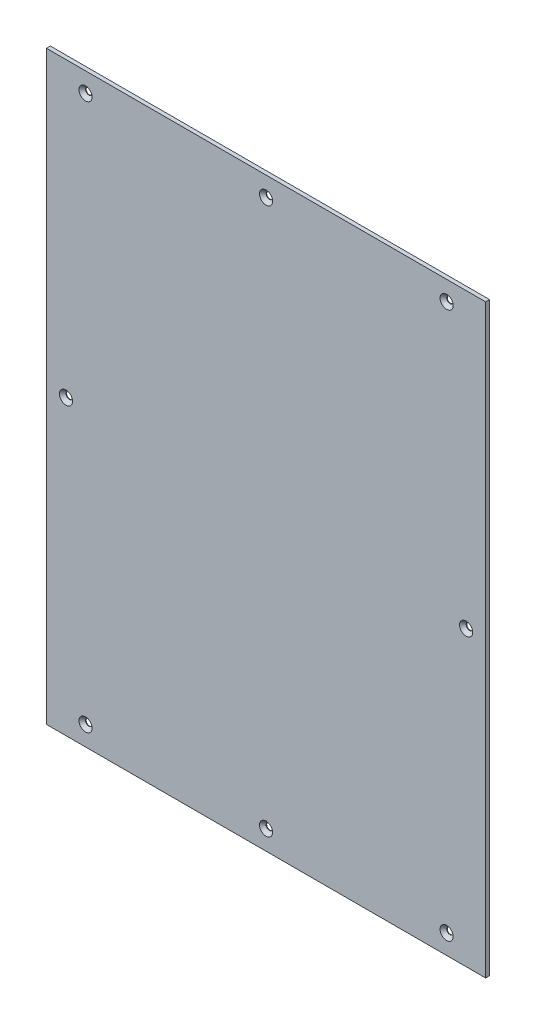
ISO-10303-21;
HEADER;
FILE_DESCRIPTION(('STEP AP214'),'2;1');
FILE_NAME('part.step','',(''),(''),'','','');
FILE_SCHEMA(('AUTOMOTIVE_DESIGN { 1 0 10303 214 1 1 1 1 }'));
ENDSEC;
DATA;
#1=APPLICATION_CONTEXT('core data for automotive mechanical design processes');
#2=APPLICATION_PROTOCOL_DEFINITION('international standard','automotive_design',2000,#1);
#3=PRODUCT_CONTEXT('',#1,'mechanical');
#4=PRODUCT('Part','Part','',(#3));
#5=PRODUCT_RELATED_PRODUCT_CATEGORY('part','',(#4));
#6=PRODUCT_DEFINITION_FORMATION('','',#4);
#7=PRODUCT_DEFINITION_CONTEXT('part definition',#1,'design');
#8=PRODUCT_DEFINITION('design','',#6,#7);
#9=PRODUCT_DEFINITION_SHAPE('','',#8);
#10=(LENGTH_UNIT() NAMED_UNIT(*) SI_UNIT(.MILLI.,.METRE.));
#11=(NAMED_UNIT(*) PLANE_ANGLE_UNIT() SI_UNIT($,.RADIAN.));
#12=(NAMED_UNIT(*) SI_UNIT($,.STERADIAN.) SOLID_ANGLE_UNIT());
#13=UNCERTAINTY_MEASURE_WITH_UNIT(LENGTH_MEASURE(1.E-05),#10,'distance_accuracy_value','');
#14=(GEOMETRIC_REPRESENTATION_CONTEXT(3) GLOBAL_UNCERTAINTY_ASSIGNED_CONTEXT((#13)) GLOBAL_UNIT_ASSIGNED_CONTEXT((#10,
#11,#12)) REPRESENTATION_CONTEXT('',''));
#15=CARTESIAN_POINT('',(0.,0.,0.));
#16=DIRECTION('',(0.,0.,1.));
#17=DIRECTION('',(1.,0.,0.));
#18=AXIS2_PLACEMENT_3D('',#15,#16,#17);
#19=CARTESIAN_POINT('',(0.,0.,4.));
#20=DIRECTION('',(0.,0.,-1.));
#21=DIRECTION('',(-1.,0.,0.));
#22=AXIS2_PLACEMENT_3D('',#19,#20,#21);
#23=PLANE('',#22);
#24=CARTESIAN_POINT('',(-205.,0.,4.));
#25=DIRECTION('',(0.,0.,1.));
#26=DIRECTION('',(1.,0.,0.));
#27=AXIS2_PLACEMENT_3D('',#24,#25,#26);
#28=CIRCLE('',#27,6.72);
#29=CARTESIAN_POINT('',(-198.28,0.,4.));
#30=VERTEX_POINT('',#29);
#31=EDGE_CURVE('E188',#30,#30,#28,.T.);
#32=ORIENTED_EDGE('',*,*,#31,.F.);
#33=EDGE_LOOP('',(#32));
#34=FACE_BOUND('',#33,.T.);
#35=CARTESIAN_POINT('',(205.,0.,4.));
#36=DIRECTION('',(0.,0.,1.));
#37=DIRECTION('',(1.,0.,0.));
#38=AXIS2_PLACEMENT_3D('',#35,#36,#37);
#39=CIRCLE('',#38,6.72);
#40=CARTESIAN_POINT('',(211.72,0.,4.));
#41=VERTEX_POINT('',#40);
#42=EDGE_CURVE('E180',#41,#41,#39,.T.);
#43=ORIENTED_EDGE('',*,*,#42,.F.);
#44=EDGE_LOOP('',(#43));
#45=FACE_BOUND('',#44,.T.);
#46=CARTESIAN_POINT('',(-185.,-280.,4.));
#47=DIRECTION('',(0.,0.,1.));
#48=DIRECTION('',(1.,0.,0.));
#49=AXIS2_PLACEMENT_3D('',#46,#47,#48);
#50=CIRCLE('',#49,6.72);
#51=CARTESIAN_POINT('',(-178.28,-280.,4.));
#52=VERTEX_POINT('',#51);
#53=EDGE_CURVE('E169',#52,#52,#50,.T.);
#54=ORIENTED_EDGE('',*,*,#53,.F.);
#55=EDGE_LOOP('',(#54));
#56=FACE_BOUND('',#55,.T.);
#57=CARTESIAN_POINT('',(185.,-280.,4.));
#58=DIRECTION('',(0.,0.,1.));
#59=DIRECTION('',(1.,0.,0.));
#60=AXIS2_PLACEMENT_3D('',#57,#58,#59);
#61=CIRCLE('',#60,6.72);
#62=CARTESIAN_POINT('',(191.72,-280.,4.));
#63=VERTEX_POINT('',#62);
#64=EDGE_CURVE('E147',#63,#63,#61,.T.);
#65=ORIENTED_EDGE('',*,*,#64,.F.);
#66=EDGE_LOOP('',(#65));
#67=FACE_BOUND('',#66,.T.);
#68=CARTESIAN_POINT('',(185.,280.,4.));
#69=DIRECTION('',(0.,0.,1.));
#70=DIRECTION('',(1.,0.,0.));
#71=AXIS2_PLACEMENT_3D('',#68,#69,#70);
#72=CIRCLE('',#71,6.72);
#73=CARTESIAN_POINT('',(191.72,280.,4.));
#74=VERTEX_POINT('',#73);
#75=EDGE_CURVE('E143',#74,#74,#72,.T.);
#76=ORIENTED_EDGE('',*,*,#75,.F.);
#77=EDGE_LOOP('',(#76));
#78=FACE_BOUND('',#77,.T.);
#79=CARTESIAN_POINT('',(0.,280.,4.));
#80=DIRECTION('',(0.,0.,1.));
#81=DIRECTION('',(1.,0.,0.));
#82=AXIS2_PLACEMENT_3D('',#79,#80,#81);
#83=CIRCLE('',#82,6.72);
#84=CARTESIAN_POINT('',(6.71999999999997,280.,4.));
#85=VERTEX_POINT('',#84);
#86=EDGE_CURVE('E135',#85,#85,#83,.T.);
#87=ORIENTED_EDGE('',*,*,#86,.F.);
#88=EDGE_LOOP('',(#87));
#89=FACE_BOUND('',#88,.T.);
#90=CARTESIAN_POINT('',(-185.,280.,4.));
#91=DIRECTION('',(0.,0.,1.));
#92=DIRECTION('',(1.,0.,0.));
#93=AXIS2_PLACEMENT_3D('',#90,#91,#92);
#94=CIRCLE('',#93,6.72);
#95=CARTESIAN_POINT('',(-178.28,280.,4.));
#96=VERTEX_POINT('',#95);
#97=EDGE_CURVE('E122',#96,#96,#94,.T.);
#98=ORIENTED_EDGE('',*,*,#97,.F.);
#99=EDGE_LOOP('',(#98));
#100=FACE_BOUND('',#99,.T.);
#101=DIRECTION('',(0.,1.,0.));
#102=VECTOR('',#101,1.);
#103=CARTESIAN_POINT('',(225.,-300.,4.));
#104=LINE('',#103,#102);
#105=CARTESIAN_POINT('',(225.,-300.,4.));
#106=VERTEX_POINT('',#105);
#107=CARTESIAN_POINT('',(225.,300.,4.));
#108=VERTEX_POINT('',#107);
#109=EDGE_CURVE('E93',#106,#108,#104,.T.);
#110=ORIENTED_EDGE('',*,*,#109,.T.);
#111=DIRECTION('',(-1.,0.,0.));
#112=VECTOR('',#111,1.);
#113=CARTESIAN_POINT('',(-225.,300.,4.));
#114=LINE('',#113,#112);
#115=CARTESIAN_POINT('',(-225.,300.,4.));
#116=VERTEX_POINT('',#115);
#117=EDGE_CURVE('E88',#108,#116,#114,.T.);
#118=ORIENTED_EDGE('',*,*,#117,.T.);
#119=DIRECTION('',(0.,-1.,0.));
#120=VECTOR('',#119,1.);
#121=CARTESIAN_POINT('',(-225.,-300.,4.));
#122=LINE('',#121,#120);
#123=CARTESIAN_POINT('',(-225.,-300.,4.));
#124=VERTEX_POINT('',#123);
#125=EDGE_CURVE('E90',#116,#124,#122,.T.);
#126=ORIENTED_EDGE('',*,*,#125,.T.);
#127=DIRECTION('',(1.,0.,0.));
#128=VECTOR('',#127,1.);
#129=CARTESIAN_POINT('',(-225.,-300.,4.));
#130=LINE('',#129,#128);
#131=EDGE_CURVE('E57',#124,#106,#130,.T.);
#132=ORIENTED_EDGE('',*,*,#131,.T.);
#133=EDGE_LOOP('',(#110,#118,#126,#132));
#134=FACE_BOUND('',#133,.T.);
#135=CARTESIAN_POINT('',(0.,-280.,4.));
#136=DIRECTION('',(0.,0.,1.));
#137=DIRECTION('',(1.,0.,0.));
#138=AXIS2_PLACEMENT_3D('',#135,#136,#137);
#139=CIRCLE('',#138,6.72);
#140=CARTESIAN_POINT('',(6.72000000000004,-280.,4.));
#141=VERTEX_POINT('',#140);
#142=EDGE_CURVE('E157',#141,#141,#139,.T.);
#143=ORIENTED_EDGE('',*,*,#142,.F.);
#144=EDGE_LOOP('',(#143));
#145=FACE_BOUND('',#144,.T.);
#146=ADVANCED_FACE('F39',(#34,#45,#56,#67,#78,#89,#100,#134,#145),#23,.F.);
#147=CARTESIAN_POINT('',(0.,0.,0.));
#148=DIRECTION('',(0.,0.,-1.));
#149=DIRECTION('',(-1.,0.,0.));
#150=AXIS2_PLACEMENT_3D('',#147,#148,#149);
#151=PLANE('',#150);
#152=CARTESIAN_POINT('',(-205.,0.,0.));
#153=DIRECTION('',(0.,0.,1.));
#154=DIRECTION('',(1.,0.,0.));
#155=AXIS2_PLACEMENT_3D('',#152,#153,#154);
#156=CIRCLE('',#155,3.3);
#157=CARTESIAN_POINT('',(-201.7,0.,0.));
#158=VERTEX_POINT('',#157);
#159=EDGE_CURVE('E179',#158,#158,#156,.T.);
#160=ORIENTED_EDGE('',*,*,#159,.T.);
#161=EDGE_LOOP('',(#160));
#162=FACE_BOUND('',#161,.T.);
#163=CARTESIAN_POINT('',(205.,0.,0.));
#164=DIRECTION('',(0.,0.,1.));
#165=DIRECTION('',(1.,0.,0.));
#166=AXIS2_PLACEMENT_3D('',#163,#164,#165);
#167=CIRCLE('',#166,3.3);
#168=CARTESIAN_POINT('',(208.3,0.,0.));
#169=VERTEX_POINT('',#168);
#170=EDGE_CURVE('E173',#169,#169,#167,.T.);
#171=ORIENTED_EDGE('',*,*,#170,.T.);
#172=EDGE_LOOP('',(#171));
#173=FACE_BOUND('',#172,.T.);
#174=CARTESIAN_POINT('',(-185.,-280.,0.));
#175=DIRECTION('',(0.,0.,1.));
#176=DIRECTION('',(1.,0.,0.));
#177=AXIS2_PLACEMENT_3D('',#174,#175,#176);
#178=CIRCLE('',#177,3.3);
#179=CARTESIAN_POINT('',(-181.7,-280.,0.));
#180=VERTEX_POINT('',#179);
#181=EDGE_CURVE('E165',#180,#180,#178,.T.);
#182=ORIENTED_EDGE('',*,*,#181,.T.);
#183=EDGE_LOOP('',(#182));
#184=FACE_BOUND('',#183,.T.);
#185=CARTESIAN_POINT('',(0.,-280.,0.));
#186=DIRECTION('',(0.,0.,1.));
#187=DIRECTION('',(1.,0.,0.));
#188=AXIS2_PLACEMENT_3D('',#185,#186,#187);
#189=CIRCLE('',#188,3.3);
#190=CARTESIAN_POINT('',(3.30000000000003,-280.,0.));
#191=VERTEX_POINT('',#190);
#192=EDGE_CURVE('E153',#191,#191,#189,.T.);
#193=ORIENTED_EDGE('',*,*,#192,.T.);
#194=EDGE_LOOP('',(#193));
#195=FACE_BOUND('',#194,.T.);
#196=CARTESIAN_POINT('',(185.,-280.,0.));
#197=DIRECTION('',(0.,0.,1.));
#198=DIRECTION('',(1.,0.,0.));
#199=AXIS2_PLACEMENT_3D('',#196,#197,#198);
#200=CIRCLE('',#199,3.3);
#201=CARTESIAN_POINT('',(188.3,-280.,0.));
#202=VERTEX_POINT('',#201);
#203=EDGE_CURVE('E145',#202,#202,#200,.T.);
#204=ORIENTED_EDGE('',*,*,#203,.T.);
#205=EDGE_LOOP('',(#204));
#206=FACE_BOUND('',#205,.T.);
#207=CARTESIAN_POINT('',(185.,280.,0.));
#208=DIRECTION('',(0.,0.,1.));
#209=DIRECTION('',(1.,0.,0.));
#210=AXIS2_PLACEMENT_3D('',#207,#208,#209);
#211=CIRCLE('',#210,3.3);
#212=CARTESIAN_POINT('',(188.3,280.,0.));
#213=VERTEX_POINT('',#212);
#214=EDGE_CURVE('E134',#213,#213,#211,.T.);
#215=ORIENTED_EDGE('',*,*,#214,.T.);
#216=EDGE_LOOP('',(#215));
#217=FACE_BOUND('',#216,.T.);
#218=DIRECTION('',(0.,1.,0.));
#219=VECTOR('',#218,1.);
#220=CARTESIAN_POINT('',(225.,-300.,0.));
#221=LINE('',#220,#219);
#222=CARTESIAN_POINT('',(225.,-300.,0.));
#223=VERTEX_POINT('',#222);
#224=CARTESIAN_POINT('',(225.,300.,0.));
#225=VERTEX_POINT('',#224);
#226=EDGE_CURVE('E103',#223,#225,#221,.T.);
#227=ORIENTED_EDGE('',*,*,#226,.F.);
#228=DIRECTION('',(1.,0.,0.));
#229=VECTOR('',#228,1.);
#230=CARTESIAN_POINT('',(-225.,-300.,0.));
#231=LINE('',#230,#229);
#232=CARTESIAN_POINT('',(-225.,-300.,0.));
#233=VERTEX_POINT('',#232);
#234=EDGE_CURVE('E77',#233,#223,#231,.T.);
#235=ORIENTED_EDGE('',*,*,#234,.F.);
#236=DIRECTION('',(0.,-1.,0.));
#237=VECTOR('',#236,1.);
#238=CARTESIAN_POINT('',(-225.,-300.,0.));
#239=LINE('',#238,#237);
#240=CARTESIAN_POINT('',(-225.,300.,0.));
#241=VERTEX_POINT('',#240);
#242=EDGE_CURVE('E71',#241,#233,#239,.T.);
#243=ORIENTED_EDGE('',*,*,#242,.F.);
#244=DIRECTION('',(-1.,0.,0.));
#245=VECTOR('',#244,1.);
#246=CARTESIAN_POINT('',(-225.,300.,0.));
#247=LINE('',#246,#245);
#248=EDGE_CURVE('E92',#225,#241,#247,.T.);
#249=ORIENTED_EDGE('',*,*,#248,.F.);
#250=EDGE_LOOP('',(#227,#235,#243,#249));
#251=FACE_BOUND('',#250,.T.);
#252=CARTESIAN_POINT('',(-185.,280.,0.));
#253=DIRECTION('',(0.,0.,1.));
#254=DIRECTION('',(1.,0.,0.));
#255=AXIS2_PLACEMENT_3D('',#252,#253,#254);
#256=CIRCLE('',#255,3.3);
#257=CARTESIAN_POINT('',(-181.7,280.,0.));
#258=VERTEX_POINT('',#257);
#259=EDGE_CURVE('E106',#258,#258,#256,.T.);
#260=ORIENTED_EDGE('',*,*,#259,.T.);
#261=EDGE_LOOP('',(#260));
#262=FACE_BOUND('',#261,.T.);
#263=CARTESIAN_POINT('',(0.,280.,0.));
#264=DIRECTION('',(0.,0.,1.));
#265=DIRECTION('',(1.,0.,0.));
#266=AXIS2_PLACEMENT_3D('',#263,#264,#265);
#267=CIRCLE('',#266,3.3);
#268=CARTESIAN_POINT('',(3.29999999999997,280.,0.));
#269=VERTEX_POINT('',#268);
#270=EDGE_CURVE('E127',#269,#269,#267,.T.);
#271=ORIENTED_EDGE('',*,*,#270,.T.);
#272=EDGE_LOOP('',(#271));
#273=FACE_BOUND('',#272,.T.);
#274=ADVANCED_FACE('F111',(#162,#173,#184,#195,#206,#217,#251,#262,#273),#151,.T.);
#275=CARTESIAN_POINT('',(225.,-300.,4.));
#276=DIRECTION('',(-1.,0.,0.));
#277=DIRECTION('',(0.,0.,1.));
#278=AXIS2_PLACEMENT_3D('',#275,#276,#277);
#279=PLANE('',#278);
#280=ORIENTED_EDGE('',*,*,#226,.T.);
#281=DIRECTION('',(0.,0.,-1.));
#282=VECTOR('',#281,1.);
#283=CARTESIAN_POINT('',(225.,300.,4.));
#284=LINE('',#283,#282);
#285=EDGE_CURVE('E11',#108,#225,#284,.T.);
#286=ORIENTED_EDGE('',*,*,#285,.F.);
#287=ORIENTED_EDGE('',*,*,#109,.F.);
#288=DIRECTION('',(0.,0.,-1.));
#289=VECTOR('',#288,1.);
#290=CARTESIAN_POINT('',(225.,-300.,4.));
#291=LINE('',#290,#289);
#292=EDGE_CURVE('E97',#106,#223,#291,.T.);
#293=ORIENTED_EDGE('',*,*,#292,.T.);
#294=EDGE_LOOP('',(#280,#286,#287,#293));
#295=FACE_BOUND('',#294,.T.);
#296=ADVANCED_FACE('F41',(#295),#279,.F.);
#297=CARTESIAN_POINT('',(-225.,300.,4.));
#298=DIRECTION('',(0.,-1.,0.));
#299=DIRECTION('',(0.,0.,-1.));
#300=AXIS2_PLACEMENT_3D('',#297,#298,#299);
#301=PLANE('',#300);
#302=ORIENTED_EDGE('',*,*,#248,.T.);
#303=DIRECTION('',(0.,0.,-1.));
#304=VECTOR('',#303,1.);
#305=CARTESIAN_POINT('',(-225.,300.,4.));
#306=LINE('',#305,#304);
#307=EDGE_CURVE('E48',#116,#241,#306,.T.);
#308=ORIENTED_EDGE('',*,*,#307,.F.);
#309=ORIENTED_EDGE('',*,*,#117,.F.);
#310=ORIENTED_EDGE('',*,*,#285,.T.);
#311=EDGE_LOOP('',(#302,#308,#309,#310));
#312=FACE_BOUND('',#311,.T.);
#313=ADVANCED_FACE('F94',(#312),#301,.F.);
#314=CARTESIAN_POINT('',(-225.,-300.,4.));
#315=DIRECTION('',(1.,0.,0.));
#316=DIRECTION('',(0.,0.,-1.));
#317=AXIS2_PLACEMENT_3D('',#314,#315,#316);
#318=PLANE('',#317);
#319=ORIENTED_EDGE('',*,*,#242,.T.);
#320=DIRECTION('',(0.,0.,-1.));
#321=VECTOR('',#320,1.);
#322=CARTESIAN_POINT('',(-225.,-300.,4.));
#323=LINE('',#322,#321);
#324=EDGE_CURVE('E96',#124,#233,#323,.T.);
#325=ORIENTED_EDGE('',*,*,#324,.F.);
#326=ORIENTED_EDGE('',*,*,#125,.F.);
#327=ORIENTED_EDGE('',*,*,#307,.T.);
#328=EDGE_LOOP('',(#319,#325,#326,#327));
#329=FACE_BOUND('',#328,.T.);
#330=ADVANCED_FACE('F100',(#329),#318,.F.);
#331=CARTESIAN_POINT('',(-225.,-300.,4.));
#332=DIRECTION('',(0.,1.,0.));
#333=DIRECTION('',(0.,0.,1.));
#334=AXIS2_PLACEMENT_3D('',#331,#332,#333);
#335=PLANE('',#334);
#336=ORIENTED_EDGE('',*,*,#234,.T.);
#337=ORIENTED_EDGE('',*,*,#292,.F.);
#338=ORIENTED_EDGE('',*,*,#131,.F.);
#339=ORIENTED_EDGE('',*,*,#324,.T.);
#340=EDGE_LOOP('',(#336,#337,#338,#339));
#341=FACE_BOUND('',#340,.T.);
#342=ADVANCED_FACE('F112',(#341),#335,.F.);
#343=CARTESIAN_POINT('',(-185.,280.,4.));
#344=DIRECTION('',(0.,0.,1.));
#345=DIRECTION('',(1.,0.,0.));
#346=AXIS2_PLACEMENT_3D('',#343,#344,#345);
#347=CYLINDRICAL_SURFACE('',#346,3.3);
#348=ORIENTED_EDGE('',*,*,#259,.F.);
#349=EDGE_LOOP('',(#348));
#350=FACE_BOUND('',#349,.T.);
#351=CARTESIAN_POINT('',(-185.,280.,0.579999999999994));
#352=DIRECTION('',(0.,0.,1.));
#353=DIRECTION('',(1.,0.,0.));
#354=AXIS2_PLACEMENT_3D('',#351,#352,#353);
#355=CIRCLE('',#354,3.3);
#356=CARTESIAN_POINT('',(-181.7,280.,0.579999999999994));
#357=VERTEX_POINT('',#356);
#358=EDGE_CURVE('E119',#357,#357,#355,.T.);
#359=ORIENTED_EDGE('',*,*,#358,.T.);
#360=EDGE_LOOP('',(#359));
#361=FACE_BOUND('',#360,.T.);
#362=ADVANCED_FACE('F209',(#350,#361),#347,.F.);
#363=CARTESIAN_POINT('',(-185.,280.,4.));
#364=DIRECTION('',(0.,0.,1.));
#365=DIRECTION('',(1.,0.,0.));
#366=AXIS2_PLACEMENT_3D('',#363,#364,#365);
#367=CONICAL_SURFACE('',#366,6.72,0.785398163397448);
#368=ORIENTED_EDGE('',*,*,#358,.F.);
#369=EDGE_LOOP('',(#368));
#370=FACE_BOUND('',#369,.T.);
#371=ORIENTED_EDGE('',*,*,#97,.T.);
#372=EDGE_LOOP('',(#371));
#373=FACE_BOUND('',#372,.T.);
#374=ADVANCED_FACE('F210',(#370,#373),#367,.F.);
#375=CARTESIAN_POINT('',(0.,280.,4.));
#376=DIRECTION('',(0.,0.,1.));
#377=DIRECTION('',(1.,0.,0.));
#378=AXIS2_PLACEMENT_3D('',#375,#376,#377);
#379=CYLINDRICAL_SURFACE('',#378,3.3);
#380=ORIENTED_EDGE('',*,*,#270,.F.);
#381=EDGE_LOOP('',(#380));
#382=FACE_BOUND('',#381,.T.);
#383=CARTESIAN_POINT('',(0.,280.,0.579999999999994));
#384=DIRECTION('',(0.,0.,1.));
#385=DIRECTION('',(1.,0.,0.));
#386=AXIS2_PLACEMENT_3D('',#383,#384,#385);
#387=CIRCLE('',#386,3.3);
#388=CARTESIAN_POINT('',(3.29999999999996,280.,0.579999999999994));
#389=VERTEX_POINT('',#388);
#390=EDGE_CURVE('E129',#389,#389,#387,.T.);
#391=ORIENTED_EDGE('',*,*,#390,.T.);
#392=EDGE_LOOP('',(#391));
#393=FACE_BOUND('',#392,.T.);
#394=ADVANCED_FACE('F207',(#382,#393),#379,.F.);
#395=CARTESIAN_POINT('',(0.,280.,4.));
#396=DIRECTION('',(0.,0.,1.));
#397=DIRECTION('',(1.,0.,0.));
#398=AXIS2_PLACEMENT_3D('',#395,#396,#397);
#399=CONICAL_SURFACE('',#398,6.72,0.785398163397448);
#400=ORIENTED_EDGE('',*,*,#390,.F.);
#401=EDGE_LOOP('',(#400));
#402=FACE_BOUND('',#401,.T.);
#403=ORIENTED_EDGE('',*,*,#86,.T.);
#404=EDGE_LOOP('',(#403));
#405=FACE_BOUND('',#404,.T.);
#406=ADVANCED_FACE('F220',(#402,#405),#399,.F.);
#407=CARTESIAN_POINT('',(185.,280.,4.));
#408=DIRECTION('',(0.,0.,1.));
#409=DIRECTION('',(1.,0.,0.));
#410=AXIS2_PLACEMENT_3D('',#407,#408,#409);
#411=CYLINDRICAL_SURFACE('',#410,3.3);
#412=ORIENTED_EDGE('',*,*,#214,.F.);
#413=EDGE_LOOP('',(#412));
#414=FACE_BOUND('',#413,.T.);
#415=CARTESIAN_POINT('',(185.,280.,0.579999999999994));
#416=DIRECTION('',(0.,0.,1.));
#417=DIRECTION('',(1.,0.,0.));
#418=AXIS2_PLACEMENT_3D('',#415,#416,#417);
#419=CIRCLE('',#418,3.3);
#420=CARTESIAN_POINT('',(188.3,280.,0.579999999999994));
#421=VERTEX_POINT('',#420);
#422=EDGE_CURVE('E137',#421,#421,#419,.T.);
#423=ORIENTED_EDGE('',*,*,#422,.T.);
#424=EDGE_LOOP('',(#423));
#425=FACE_BOUND('',#424,.T.);
#426=ADVANCED_FACE('F288',(#414,#425),#411,.F.);
#427=CARTESIAN_POINT('',(185.,280.,4.));
#428=DIRECTION('',(0.,0.,1.));
#429=DIRECTION('',(1.,0.,0.));
#430=AXIS2_PLACEMENT_3D('',#427,#428,#429);
#431=CONICAL_SURFACE('',#430,6.72,0.785398163397448);
#432=ORIENTED_EDGE('',*,*,#422,.F.);
#433=EDGE_LOOP('',(#432));
#434=FACE_BOUND('',#433,.T.);
#435=ORIENTED_EDGE('',*,*,#75,.T.);
#436=EDGE_LOOP('',(#435));
#437=FACE_BOUND('',#436,.T.);
#438=ADVANCED_FACE('F296',(#434,#437),#431,.F.);
#439=CARTESIAN_POINT('',(185.,-280.,4.));
#440=DIRECTION('',(0.,0.,1.));
#441=DIRECTION('',(1.,0.,0.));
#442=AXIS2_PLACEMENT_3D('',#439,#440,#441);
#443=CYLINDRICAL_SURFACE('',#442,3.3);
#444=ORIENTED_EDGE('',*,*,#203,.F.);
#445=EDGE_LOOP('',(#444));
#446=FACE_BOUND('',#445,.T.);
#447=CARTESIAN_POINT('',(185.,-280.,0.579999999999994));
#448=DIRECTION('',(0.,0.,1.));
#449=DIRECTION('',(1.,0.,0.));
#450=AXIS2_PLACEMENT_3D('',#447,#448,#449);
#451=CIRCLE('',#450,3.3);
#452=CARTESIAN_POINT('',(188.3,-280.,0.579999999999994));
#453=VERTEX_POINT('',#452);
#454=EDGE_CURVE('E150',#453,#453,#451,.T.);
#455=ORIENTED_EDGE('',*,*,#454,.T.);
#456=EDGE_LOOP('',(#455));
#457=FACE_BOUND('',#456,.T.);
#458=ADVANCED_FACE('F306',(#446,#457),#443,.F.);
#459=CARTESIAN_POINT('',(185.,-280.,4.));
#460=DIRECTION('',(0.,0.,1.));
#461=DIRECTION('',(1.,0.,0.));
#462=AXIS2_PLACEMENT_3D('',#459,#460,#461);
#463=CONICAL_SURFACE('',#462,6.72,0.785398163397448);
#464=ORIENTED_EDGE('',*,*,#454,.F.);
#465=EDGE_LOOP('',(#464));
#466=FACE_BOUND('',#465,.T.);
#467=ORIENTED_EDGE('',*,*,#64,.T.);
#468=EDGE_LOOP('',(#467));
#469=FACE_BOUND('',#468,.T.);
#470=ADVANCED_FACE('F318',(#466,#469),#463,.F.);
#471=CARTESIAN_POINT('',(0.,-280.,4.));
#472=DIRECTION('',(0.,0.,1.));
#473=DIRECTION('',(1.,0.,0.));
#474=AXIS2_PLACEMENT_3D('',#471,#472,#473);
#475=CYLINDRICAL_SURFACE('',#474,3.3);
#476=ORIENTED_EDGE('',*,*,#192,.F.);
#477=EDGE_LOOP('',(#476));
#478=FACE_BOUND('',#477,.T.);
#479=CARTESIAN_POINT('',(0.,-280.,0.579999999999994));
#480=DIRECTION('',(0.,0.,1.));
#481=DIRECTION('',(1.,0.,0.));
#482=AXIS2_PLACEMENT_3D('',#479,#480,#481);
#483=CIRCLE('',#482,3.3);
#484=CARTESIAN_POINT('',(3.30000000000003,-280.,0.579999999999994));
#485=VERTEX_POINT('',#484);
#486=EDGE_CURVE('E156',#485,#485,#483,.T.);
#487=ORIENTED_EDGE('',*,*,#486,.T.);
#488=EDGE_LOOP('',(#487));
#489=FACE_BOUND('',#488,.T.);
#490=ADVANCED_FACE('F327',(#478,#489),#475,.F.);
#491=CARTESIAN_POINT('',(0.,-280.,4.));
#492=DIRECTION('',(0.,0.,1.));
#493=DIRECTION('',(1.,0.,0.));
#494=AXIS2_PLACEMENT_3D('',#491,#492,#493);
#495=CONICAL_SURFACE('',#494,6.72,0.785398163397448);
#496=ORIENTED_EDGE('',*,*,#486,.F.);
#497=EDGE_LOOP('',(#496));
#498=FACE_BOUND('',#497,.T.);
#499=ORIENTED_EDGE('',*,*,#142,.T.);
#500=EDGE_LOOP('',(#499));
#501=FACE_BOUND('',#500,.T.);
#502=ADVANCED_FACE('F336',(#498,#501),#495,.F.);
#503=CARTESIAN_POINT('',(-185.,-280.,4.));
#504=DIRECTION('',(0.,0.,1.));
#505=DIRECTION('',(1.,0.,0.));
#506=AXIS2_PLACEMENT_3D('',#503,#504,#505);
#507=CYLINDRICAL_SURFACE('',#506,3.3);
#508=ORIENTED_EDGE('',*,*,#181,.F.);
#509=EDGE_LOOP('',(#508));
#510=FACE_BOUND('',#509,.T.);
#511=CARTESIAN_POINT('',(-185.,-280.,0.579999999999994));
#512=DIRECTION('',(0.,0.,1.));
#513=DIRECTION('',(1.,0.,0.));
#514=AXIS2_PLACEMENT_3D('',#511,#512,#513);
#515=CIRCLE('',#514,3.3);
#516=CARTESIAN_POINT('',(-181.7,-280.,0.579999999999994));
#517=VERTEX_POINT('',#516);
#518=EDGE_CURVE('E164',#517,#517,#515,.T.);
#519=ORIENTED_EDGE('',*,*,#518,.T.);
#520=EDGE_LOOP('',(#519));
#521=FACE_BOUND('',#520,.T.);
#522=ADVANCED_FACE('F346',(#510,#521),#507,.F.);
#523=CARTESIAN_POINT('',(-185.,-280.,4.));
#524=DIRECTION('',(0.,0.,1.));
#525=DIRECTION('',(1.,0.,0.));
#526=AXIS2_PLACEMENT_3D('',#523,#524,#525);
#527=CONICAL_SURFACE('',#526,6.72,0.785398163397448);
#528=ORIENTED_EDGE('',*,*,#518,.F.);
#529=EDGE_LOOP('',(#528));
#530=FACE_BOUND('',#529,.T.);
#531=ORIENTED_EDGE('',*,*,#53,.T.);
#532=EDGE_LOOP('',(#531));
#533=FACE_BOUND('',#532,.T.);
#534=ADVANCED_FACE('F357',(#530,#533),#527,.F.);
#535=CARTESIAN_POINT('',(205.,0.,4.));
#536=DIRECTION('',(0.,0.,1.));
#537=DIRECTION('',(1.,0.,0.));
#538=AXIS2_PLACEMENT_3D('',#535,#536,#537);
#539=CYLINDRICAL_SURFACE('',#538,3.3);
#540=ORIENTED_EDGE('',*,*,#170,.F.);
#541=EDGE_LOOP('',(#540));
#542=FACE_BOUND('',#541,.T.);
#543=CARTESIAN_POINT('',(205.,0.,0.579999999999994));
#544=DIRECTION('',(0.,0.,1.));
#545=DIRECTION('',(1.,0.,0.));
#546=AXIS2_PLACEMENT_3D('',#543,#544,#545);
#547=CIRCLE('',#546,3.3);
#548=CARTESIAN_POINT('',(208.3,0.,0.579999999999994));
#549=VERTEX_POINT('',#548);
#550=EDGE_CURVE('E172',#549,#549,#547,.T.);
#551=ORIENTED_EDGE('',*,*,#550,.T.);
#552=EDGE_LOOP('',(#551));
#553=FACE_BOUND('',#552,.T.);
#554=ADVANCED_FACE('F366',(#542,#553),#539,.F.);
#555=CARTESIAN_POINT('',(205.,0.,4.));
#556=DIRECTION('',(0.,0.,1.));
#557=DIRECTION('',(1.,0.,0.));
#558=AXIS2_PLACEMENT_3D('',#555,#556,#557);
#559=CONICAL_SURFACE('',#558,6.72,0.785398163397448);
#560=ORIENTED_EDGE('',*,*,#550,.F.);
#561=EDGE_LOOP('',(#560));
#562=FACE_BOUND('',#561,.T.);
#563=ORIENTED_EDGE('',*,*,#42,.T.);
#564=EDGE_LOOP('',(#563));
#565=FACE_BOUND('',#564,.T.);
#566=ADVANCED_FACE('F378',(#562,#565),#559,.F.);
#567=CARTESIAN_POINT('',(-205.,0.,4.));
#568=DIRECTION('',(0.,0.,1.));
#569=DIRECTION('',(1.,0.,0.));
#570=AXIS2_PLACEMENT_3D('',#567,#568,#569);
#571=CYLINDRICAL_SURFACE('',#570,3.3);
#572=ORIENTED_EDGE('',*,*,#159,.F.);
#573=EDGE_LOOP('',(#572));
#574=FACE_BOUND('',#573,.T.);
#575=CARTESIAN_POINT('',(-205.,0.,0.579999999999994));
#576=DIRECTION('',(0.,0.,1.));
#577=DIRECTION('',(1.,0.,0.));
#578=AXIS2_PLACEMENT_3D('',#575,#576,#577);
#579=CIRCLE('',#578,3.3);
#580=CARTESIAN_POINT('',(-201.7,0.,0.579999999999994));
#581=VERTEX_POINT('',#580);
#582=EDGE_CURVE('E181',#581,#581,#579,.T.);
#583=ORIENTED_EDGE('',*,*,#582,.T.);
#584=EDGE_LOOP('',(#583));
#585=FACE_BOUND('',#584,.T.);
#586=ADVANCED_FACE('F389',(#574,#585),#571,.F.);
#587=CARTESIAN_POINT('',(-205.,0.,4.));
#588=DIRECTION('',(0.,0.,1.));
#589=DIRECTION('',(1.,0.,0.));
#590=AXIS2_PLACEMENT_3D('',#587,#588,#589);
#591=CONICAL_SURFACE('',#590,6.72,0.785398163397448);
#592=ORIENTED_EDGE('',*,*,#582,.F.);
#593=EDGE_LOOP('',(#592));
#594=FACE_BOUND('',#593,.T.);
#595=ORIENTED_EDGE('',*,*,#31,.T.);
#596=EDGE_LOOP('',(#595));
#597=FACE_BOUND('',#596,.T.);
#598=ADVANCED_FACE('F189',(#594,#597),#591,.F.);
#599=CLOSED_SHELL('',(#146,#274,#296,#313,#330,#342,#362,#374,#394,#406,#426,#438,#458,#470,
#490,#502,#522,#534,#554,#566,#586,#598));
#600=MANIFOLD_SOLID_BREP('B2',#599);
#601=ADVANCED_BREP_SHAPE_REPRESENTATION('',(#18,#600),#14);
#602=SHAPE_DEFINITION_REPRESENTATION(#9,#601);
ENDSEC;
END-ISO-10303-21;
